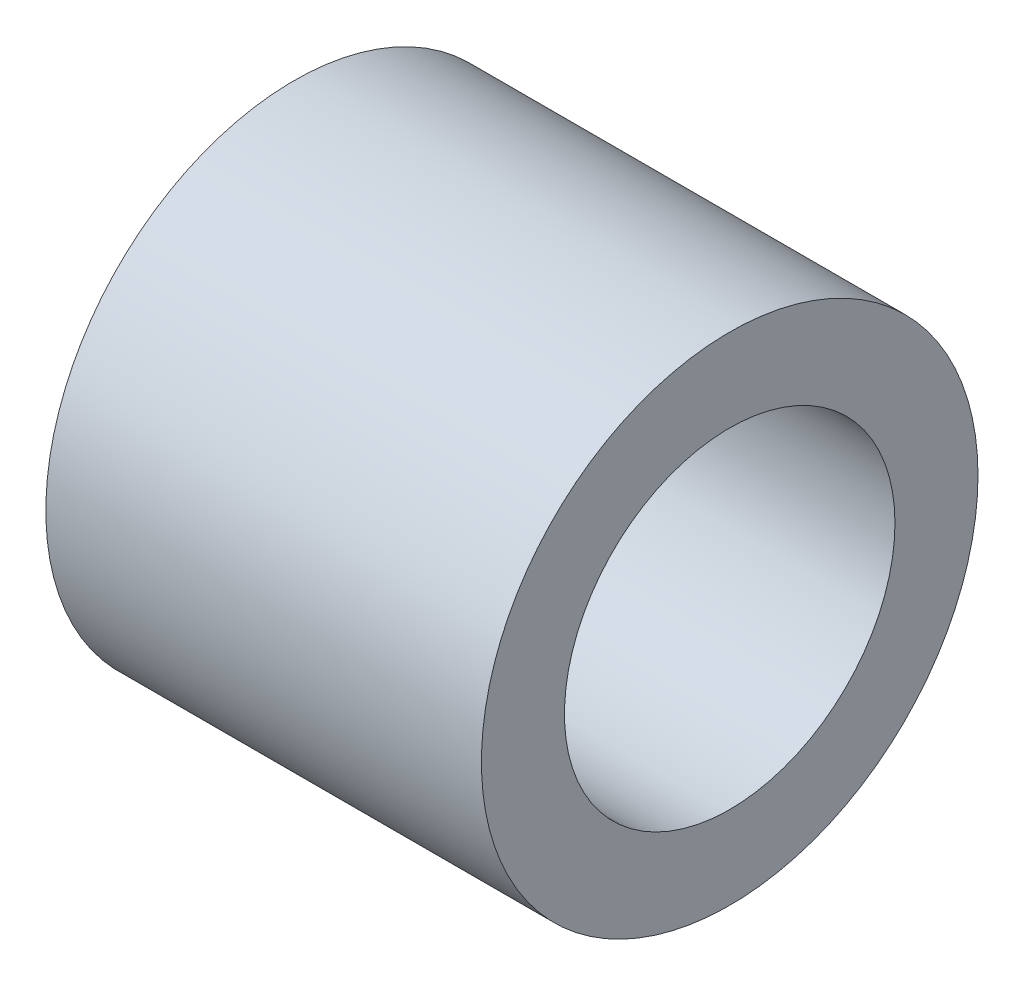
ISO-10303-21;
HEADER;
FILE_DESCRIPTION(('STEP AP214'),'2;1');
FILE_NAME('part.step','',(''),(''),'','','');
FILE_SCHEMA(('AUTOMOTIVE_DESIGN { 1 0 10303 214 1 1 1 1 }'));
ENDSEC;
DATA;
#1=APPLICATION_CONTEXT('core data for automotive mechanical design processes');
#2=APPLICATION_PROTOCOL_DEFINITION('international standard','automotive_design',2000,#1);
#3=PRODUCT_CONTEXT('',#1,'mechanical');
#4=PRODUCT('Part','Part','',(#3));
#5=PRODUCT_RELATED_PRODUCT_CATEGORY('part','',(#4));
#6=PRODUCT_DEFINITION_FORMATION('','',#4);
#7=PRODUCT_DEFINITION_CONTEXT('part definition',#1,'design');
#8=PRODUCT_DEFINITION('design','',#6,#7);
#9=PRODUCT_DEFINITION_SHAPE('','',#8);
#10=(LENGTH_UNIT() NAMED_UNIT(*) SI_UNIT(.MILLI.,.METRE.));
#11=(NAMED_UNIT(*) PLANE_ANGLE_UNIT() SI_UNIT($,.RADIAN.));
#12=(NAMED_UNIT(*) SI_UNIT($,.STERADIAN.) SOLID_ANGLE_UNIT());
#13=UNCERTAINTY_MEASURE_WITH_UNIT(LENGTH_MEASURE(1.E-05),#10,'distance_accuracy_value','');
#14=(GEOMETRIC_REPRESENTATION_CONTEXT(3) GLOBAL_UNCERTAINTY_ASSIGNED_CONTEXT((#13)) GLOBAL_UNIT_ASSIGNED_CONTEXT((#10,
#11,#12)) REPRESENTATION_CONTEXT('',''));
#15=CARTESIAN_POINT('',(0.,0.,0.));
#16=DIRECTION('',(0.,0.,1.));
#17=DIRECTION('',(1.,0.,0.));
#18=AXIS2_PLACEMENT_3D('',#15,#16,#17);
#19=CARTESIAN_POINT('',(3.4925,0.,0.));
#20=DIRECTION('',(1.,0.,0.));
#21=DIRECTION('',(0.,0.,-1.));
#22=AXIS2_PLACEMENT_3D('',#19,#20,#21);
#23=PLANE('',#22);
#24=CARTESIAN_POINT('',(3.4925,0.,0.));
#25=DIRECTION('',(1.,0.,0.));
#26=DIRECTION('',(0.,0.,-1.));
#27=AXIS2_PLACEMENT_3D('',#24,#25,#26);
#28=CIRCLE('',#27,3.98145);
#29=CARTESIAN_POINT('',(3.4925,0.,-3.98145));
#30=VERTEX_POINT('',#29);
#31=EDGE_CURVE('E10',#30,#30,#28,.T.);
#32=ORIENTED_EDGE('',*,*,#31,.T.);
#33=EDGE_LOOP('',(#32));
#34=FACE_BOUND('',#33,.T.);
#35=CARTESIAN_POINT('',(3.4925,0.,0.));
#36=DIRECTION('',(1.,0.,0.));
#37=DIRECTION('',(0.,0.,-1.));
#38=AXIS2_PLACEMENT_3D('',#35,#36,#37);
#39=CIRCLE('',#38,2.65);
#40=CARTESIAN_POINT('',(3.4925,0.,-2.65));
#41=VERTEX_POINT('',#40);
#42=EDGE_CURVE('E56',#41,#41,#39,.T.);
#43=ORIENTED_EDGE('',*,*,#42,.F.);
#44=EDGE_LOOP('',(#43));
#45=FACE_BOUND('',#44,.T.);
#46=ADVANCED_FACE('F43',(#34,#45),#23,.T.);
#47=CARTESIAN_POINT('',(-3.4925,0.,0.));
#48=DIRECTION('',(1.,0.,0.));
#49=DIRECTION('',(0.,0.,-1.));
#50=AXIS2_PLACEMENT_3D('',#47,#48,#49);
#51=PLANE('',#50);
#52=CARTESIAN_POINT('',(-3.4925,0.,0.));
#53=DIRECTION('',(1.,0.,0.));
#54=DIRECTION('',(0.,0.,-1.));
#55=AXIS2_PLACEMENT_3D('',#52,#53,#54);
#56=CIRCLE('',#55,3.98145);
#57=CARTESIAN_POINT('',(-3.4925,0.,-3.98145));
#58=VERTEX_POINT('',#57);
#59=EDGE_CURVE('E47',#58,#58,#56,.T.);
#60=ORIENTED_EDGE('',*,*,#59,.F.);
#61=EDGE_LOOP('',(#60));
#62=FACE_BOUND('',#61,.T.);
#63=CARTESIAN_POINT('',(-3.4925,0.,0.));
#64=DIRECTION('',(1.,0.,0.));
#65=DIRECTION('',(0.,0.,-1.));
#66=AXIS2_PLACEMENT_3D('',#63,#64,#65);
#67=CIRCLE('',#66,2.65);
#68=CARTESIAN_POINT('',(-3.4925,0.,-2.65));
#69=VERTEX_POINT('',#68);
#70=EDGE_CURVE('E58',#69,#69,#67,.T.);
#71=ORIENTED_EDGE('',*,*,#70,.T.);
#72=EDGE_LOOP('',(#71));
#73=FACE_BOUND('',#72,.T.);
#74=ADVANCED_FACE('F70',(#62,#73),#51,.F.);
#75=CARTESIAN_POINT('',(3.4925,0.,0.));
#76=DIRECTION('',(-1.,0.,0.));
#77=DIRECTION('',(0.,0.,1.));
#78=AXIS2_PLACEMENT_3D('',#75,#76,#77);
#79=CYLINDRICAL_SURFACE('',#78,3.98145);
#80=ORIENTED_EDGE('',*,*,#31,.F.);
#81=EDGE_LOOP('',(#80));
#82=FACE_BOUND('',#81,.T.);
#83=ORIENTED_EDGE('',*,*,#59,.T.);
#84=EDGE_LOOP('',(#83));
#85=FACE_BOUND('',#84,.T.);
#86=ADVANCED_FACE('F45',(#82,#85),#79,.T.);
#87=CARTESIAN_POINT('',(3.4925,0.,0.));
#88=DIRECTION('',(-1.,0.,0.));
#89=DIRECTION('',(0.,0.,1.));
#90=AXIS2_PLACEMENT_3D('',#87,#88,#89);
#91=CYLINDRICAL_SURFACE('',#90,2.65);
#92=ORIENTED_EDGE('',*,*,#42,.T.);
#93=EDGE_LOOP('',(#92));
#94=FACE_BOUND('',#93,.T.);
#95=ORIENTED_EDGE('',*,*,#70,.F.);
#96=EDGE_LOOP('',(#95));
#97=FACE_BOUND('',#96,.T.);
#98=ADVANCED_FACE('F66',(#94,#97),#91,.F.);
#99=CLOSED_SHELL('',(#46,#74,#86,#98));
#100=MANIFOLD_SOLID_BREP('B2',#99);
#101=ADVANCED_BREP_SHAPE_REPRESENTATION('',(#18,#100),#14);
#102=SHAPE_DEFINITION_REPRESENTATION(#9,#101);
ENDSEC;
END-ISO-10303-21;
